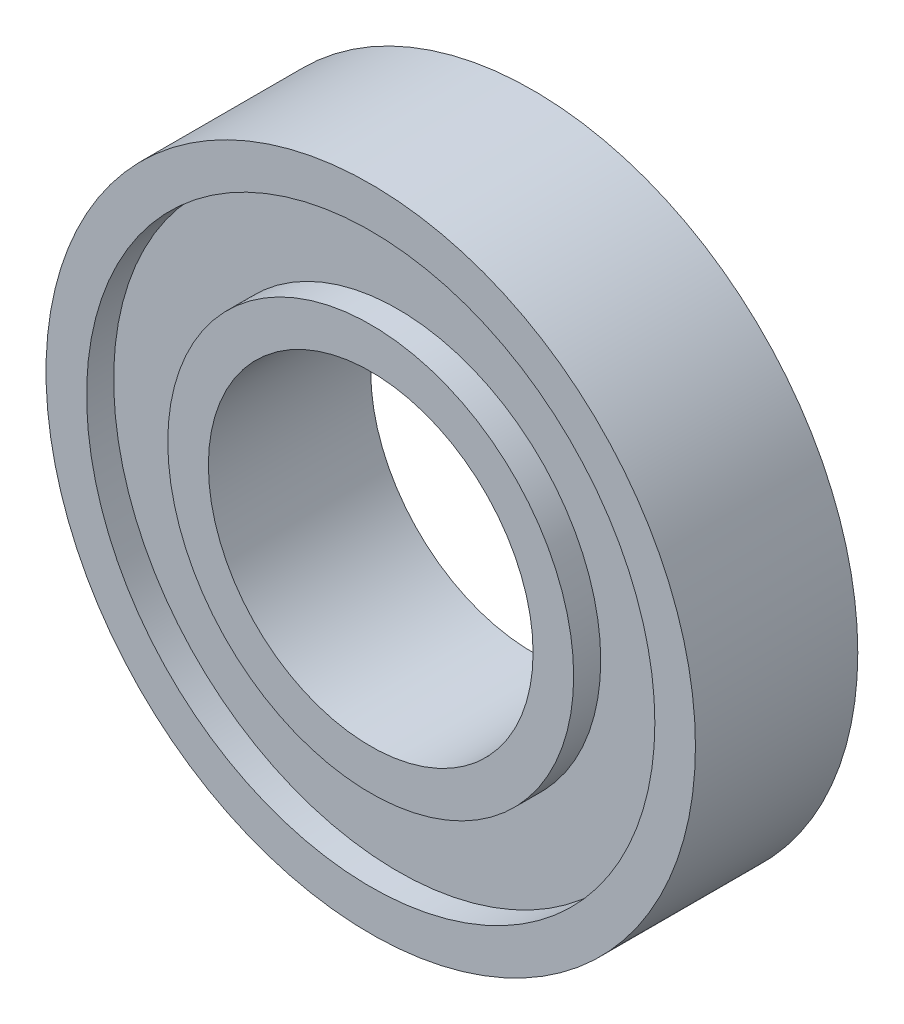
ISO-10303-21;
HEADER;
FILE_DESCRIPTION(('STEP AP214'),'2;1');
FILE_NAME('part.step','',(''),(''),'','','');
FILE_SCHEMA(('AUTOMOTIVE_DESIGN { 1 0 10303 214 1 1 1 1 }'));
ENDSEC;
DATA;
#1=APPLICATION_CONTEXT('core data for automotive mechanical design processes');
#2=APPLICATION_PROTOCOL_DEFINITION('international standard','automotive_design',2000,#1);
#3=PRODUCT_CONTEXT('',#1,'mechanical');
#4=PRODUCT('Part','Part','',(#3));
#5=PRODUCT_RELATED_PRODUCT_CATEGORY('part','',(#4));
#6=PRODUCT_DEFINITION_FORMATION('','',#4);
#7=PRODUCT_DEFINITION_CONTEXT('part definition',#1,'design');
#8=PRODUCT_DEFINITION('design','',#6,#7);
#9=PRODUCT_DEFINITION_SHAPE('','',#8);
#10=(LENGTH_UNIT() NAMED_UNIT(*) SI_UNIT(.MILLI.,.METRE.));
#11=(NAMED_UNIT(*) PLANE_ANGLE_UNIT() SI_UNIT($,.RADIAN.));
#12=(NAMED_UNIT(*) SI_UNIT($,.STERADIAN.) SOLID_ANGLE_UNIT());
#13=UNCERTAINTY_MEASURE_WITH_UNIT(LENGTH_MEASURE(1.E-05),#10,'distance_accuracy_value','');
#14=(GEOMETRIC_REPRESENTATION_CONTEXT(3) GLOBAL_UNCERTAINTY_ASSIGNED_CONTEXT((#13)) GLOBAL_UNIT_ASSIGNED_CONTEXT((#10,
#11,#12)) REPRESENTATION_CONTEXT('',''));
#15=CARTESIAN_POINT('',(0.,0.,0.));
#16=DIRECTION('',(0.,0.,1.));
#17=DIRECTION('',(1.,0.,0.));
#18=AXIS2_PLACEMENT_3D('',#15,#16,#17);
#19=CARTESIAN_POINT('',(0.,0.,-1.5));
#20=DIRECTION('',(0.,0.,1.));
#21=DIRECTION('',(1.,0.,0.));
#22=AXIS2_PLACEMENT_3D('',#19,#20,#21);
#23=PLANE('',#22);
#24=CARTESIAN_POINT('',(0.,0.,-1.5));
#25=DIRECTION('',(0.,0.,1.));
#26=DIRECTION('',(1.,0.,0.));
#27=AXIS2_PLACEMENT_3D('',#24,#25,#26);
#28=CIRCLE('',#27,3.);
#29=CARTESIAN_POINT('',(3.,0.,-1.5));
#30=VERTEX_POINT('',#29);
#31=EDGE_CURVE('E47',#30,#30,#28,.T.);
#32=ORIENTED_EDGE('',*,*,#31,.T.);
#33=EDGE_LOOP('',(#32));
#34=FACE_BOUND('',#33,.T.);
#35=CARTESIAN_POINT('',(0.,0.,-1.5));
#36=DIRECTION('',(0.,0.,1.));
#37=DIRECTION('',(1.,0.,0.));
#38=AXIS2_PLACEMENT_3D('',#35,#36,#37);
#39=CIRCLE('',#38,3.75);
#40=CARTESIAN_POINT('',(3.75,0.,-1.5));
#41=VERTEX_POINT('',#40);
#42=EDGE_CURVE('E71',#41,#41,#39,.T.);
#43=ORIENTED_EDGE('',*,*,#42,.F.);
#44=EDGE_LOOP('',(#43));
#45=FACE_BOUND('',#44,.T.);
#46=ADVANCED_FACE('F34',(#34,#45),#23,.F.);
#47=CARTESIAN_POINT('',(0.,0.,1.5));
#48=DIRECTION('',(0.,0.,1.));
#49=DIRECTION('',(1.,0.,0.));
#50=AXIS2_PLACEMENT_3D('',#47,#48,#49);
#51=PLANE('',#50);
#52=CARTESIAN_POINT('',(0.,0.,1.5));
#53=DIRECTION('',(0.,0.,1.));
#54=DIRECTION('',(1.,0.,0.));
#55=AXIS2_PLACEMENT_3D('',#52,#53,#54);
#56=CIRCLE('',#55,3.);
#57=CARTESIAN_POINT('',(3.,0.,1.5));
#58=VERTEX_POINT('',#57);
#59=EDGE_CURVE('E45',#58,#58,#56,.T.);
#60=ORIENTED_EDGE('',*,*,#59,.F.);
#61=EDGE_LOOP('',(#60));
#62=FACE_BOUND('',#61,.T.);
#63=CARTESIAN_POINT('',(0.,0.,1.5));
#64=DIRECTION('',(0.,0.,1.));
#65=DIRECTION('',(1.,0.,0.));
#66=AXIS2_PLACEMENT_3D('',#63,#64,#65);
#67=CIRCLE('',#66,3.75);
#68=CARTESIAN_POINT('',(3.75,0.,1.5));
#69=VERTEX_POINT('',#68);
#70=EDGE_CURVE('E59',#69,#69,#67,.T.);
#71=ORIENTED_EDGE('',*,*,#70,.T.);
#72=EDGE_LOOP('',(#71));
#73=FACE_BOUND('',#72,.T.);
#74=ADVANCED_FACE('F87',(#62,#73),#51,.T.);
#75=CARTESIAN_POINT('',(0.,0.,1.5));
#76=DIRECTION('',(0.,0.,1.));
#77=DIRECTION('',(1.,0.,0.));
#78=AXIS2_PLACEMENT_3D('',#75,#76,#77);
#79=CIRCLE('',#78,5.25);
#80=CARTESIAN_POINT('',(5.25,0.,1.5));
#81=VERTEX_POINT('',#80);
#82=EDGE_CURVE('E53',#81,#81,#79,.T.);
#83=ORIENTED_EDGE('',*,*,#82,.F.);
#84=EDGE_LOOP('',(#83));
#85=FACE_BOUND('',#84,.T.);
#86=CARTESIAN_POINT('',(0.,0.,1.5));
#87=DIRECTION('',(0.,0.,1.));
#88=DIRECTION('',(1.,0.,0.));
#89=AXIS2_PLACEMENT_3D('',#86,#87,#88);
#90=CIRCLE('',#89,6.);
#91=CARTESIAN_POINT('',(6.,0.,1.5));
#92=VERTEX_POINT('',#91);
#93=EDGE_CURVE('E10',#92,#92,#90,.T.);
#94=ORIENTED_EDGE('',*,*,#93,.T.);
#95=EDGE_LOOP('',(#94));
#96=FACE_BOUND('',#95,.T.);
#97=ADVANCED_FACE('F95',(#85,#96),#51,.T.);
#98=CARTESIAN_POINT('',(0.,0.,-1.5));
#99=DIRECTION('',(0.,0.,1.));
#100=DIRECTION('',(1.,0.,0.));
#101=AXIS2_PLACEMENT_3D('',#98,#99,#100);
#102=CIRCLE('',#101,5.25);
#103=CARTESIAN_POINT('',(5.25,0.,-1.5));
#104=VERTEX_POINT('',#103);
#105=EDGE_CURVE('E65',#104,#104,#102,.T.);
#106=ORIENTED_EDGE('',*,*,#105,.T.);
#107=EDGE_LOOP('',(#106));
#108=FACE_BOUND('',#107,.T.);
#109=CARTESIAN_POINT('',(0.,0.,-1.5));
#110=DIRECTION('',(0.,0.,1.));
#111=DIRECTION('',(1.,0.,0.));
#112=AXIS2_PLACEMENT_3D('',#109,#110,#111);
#113=CIRCLE('',#112,6.);
#114=CARTESIAN_POINT('',(6.,0.,-1.5));
#115=VERTEX_POINT('',#114);
#116=EDGE_CURVE('E38',#115,#115,#113,.T.);
#117=ORIENTED_EDGE('',*,*,#116,.F.);
#118=EDGE_LOOP('',(#117));
#119=FACE_BOUND('',#118,.T.);
#120=ADVANCED_FACE('F89',(#108,#119),#23,.F.);
#121=CARTESIAN_POINT('',(0.,0.,1.5));
#122=DIRECTION('',(0.,0.,-1.));
#123=DIRECTION('',(-1.,0.,0.));
#124=AXIS2_PLACEMENT_3D('',#121,#122,#123);
#125=CYLINDRICAL_SURFACE('',#124,6.);
#126=ORIENTED_EDGE('',*,*,#93,.F.);
#127=EDGE_LOOP('',(#126));
#128=FACE_BOUND('',#127,.T.);
#129=ORIENTED_EDGE('',*,*,#116,.T.);
#130=EDGE_LOOP('',(#129));
#131=FACE_BOUND('',#130,.T.);
#132=ADVANCED_FACE('F36',(#128,#131),#125,.T.);
#133=CARTESIAN_POINT('',(0.,0.,1.5));
#134=DIRECTION('',(0.,0.,-1.));
#135=DIRECTION('',(-1.,0.,0.));
#136=AXIS2_PLACEMENT_3D('',#133,#134,#135);
#137=CYLINDRICAL_SURFACE('',#136,3.);
#138=ORIENTED_EDGE('',*,*,#59,.T.);
#139=EDGE_LOOP('',(#138));
#140=FACE_BOUND('',#139,.T.);
#141=ORIENTED_EDGE('',*,*,#31,.F.);
#142=EDGE_LOOP('',(#141));
#143=FACE_BOUND('',#142,.T.);
#144=ADVANCED_FACE('F103',(#140,#143),#137,.F.);
#145=CARTESIAN_POINT('',(0.,0.,1.));
#146=DIRECTION('',(0.,0.,1.));
#147=DIRECTION('',(1.,0.,0.));
#148=AXIS2_PLACEMENT_3D('',#145,#146,#147);
#149=CYLINDRICAL_SURFACE('',#148,5.25);
#150=CARTESIAN_POINT('',(0.,0.,1.));
#151=DIRECTION('',(0.,0.,1.));
#152=DIRECTION('',(1.,0.,0.));
#153=AXIS2_PLACEMENT_3D('',#150,#151,#152);
#154=CIRCLE('',#153,5.25);
#155=CARTESIAN_POINT('',(5.25,0.,1.));
#156=VERTEX_POINT('',#155);
#157=EDGE_CURVE('E50',#156,#156,#154,.T.);
#158=ORIENTED_EDGE('',*,*,#157,.F.);
#159=EDGE_LOOP('',(#158));
#160=FACE_BOUND('',#159,.T.);
#161=ORIENTED_EDGE('',*,*,#82,.T.);
#162=EDGE_LOOP('',(#161));
#163=FACE_BOUND('',#162,.T.);
#164=ADVANCED_FACE('F128',(#160,#163),#149,.F.);
#165=CARTESIAN_POINT('',(0.,0.,1.));
#166=DIRECTION('',(0.,0.,1.));
#167=DIRECTION('',(1.,0.,0.));
#168=AXIS2_PLACEMENT_3D('',#165,#166,#167);
#169=PLANE('',#168);
#170=CARTESIAN_POINT('',(0.,0.,1.));
#171=DIRECTION('',(0.,0.,1.));
#172=DIRECTION('',(1.,0.,0.));
#173=AXIS2_PLACEMENT_3D('',#170,#171,#172);
#174=CIRCLE('',#173,3.75);
#175=CARTESIAN_POINT('',(3.75,0.,1.));
#176=VERTEX_POINT('',#175);
#177=EDGE_CURVE('E56',#176,#176,#174,.T.);
#178=ORIENTED_EDGE('',*,*,#177,.F.);
#179=EDGE_LOOP('',(#178));
#180=FACE_BOUND('',#179,.T.);
#181=ORIENTED_EDGE('',*,*,#157,.T.);
#182=EDGE_LOOP('',(#181));
#183=FACE_BOUND('',#182,.T.);
#184=ADVANCED_FACE('F124',(#180,#183),#169,.T.);
#185=CARTESIAN_POINT('',(0.,0.,1.));
#186=DIRECTION('',(0.,0.,1.));
#187=DIRECTION('',(1.,0.,0.));
#188=AXIS2_PLACEMENT_3D('',#185,#186,#187);
#189=CYLINDRICAL_SURFACE('',#188,3.75);
#190=ORIENTED_EDGE('',*,*,#177,.T.);
#191=EDGE_LOOP('',(#190));
#192=FACE_BOUND('',#191,.T.);
#193=ORIENTED_EDGE('',*,*,#70,.F.);
#194=EDGE_LOOP('',(#193));
#195=FACE_BOUND('',#194,.T.);
#196=ADVANCED_FACE('F118',(#192,#195),#189,.T.);
#197=CARTESIAN_POINT('',(0.,0.,-1.));
#198=DIRECTION('',(0.,0.,-1.));
#199=DIRECTION('',(1.,0.,0.));
#200=AXIS2_PLACEMENT_3D('',#197,#198,#199);
#201=PLANE('',#200);
#202=CARTESIAN_POINT('',(0.,0.,-1.));
#203=DIRECTION('',(0.,0.,1.));
#204=DIRECTION('',(1.,0.,0.));
#205=AXIS2_PLACEMENT_3D('',#202,#203,#204);
#206=CIRCLE('',#205,5.25);
#207=CARTESIAN_POINT('',(5.25,0.,-1.));
#208=VERTEX_POINT('',#207);
#209=EDGE_CURVE('E62',#208,#208,#206,.T.);
#210=ORIENTED_EDGE('',*,*,#209,.F.);
#211=EDGE_LOOP('',(#210));
#212=FACE_BOUND('',#211,.T.);
#213=CARTESIAN_POINT('',(0.,0.,-1.));
#214=DIRECTION('',(0.,0.,1.));
#215=DIRECTION('',(1.,0.,0.));
#216=AXIS2_PLACEMENT_3D('',#213,#214,#215);
#217=CIRCLE('',#216,3.75);
#218=CARTESIAN_POINT('',(3.75,0.,-1.));
#219=VERTEX_POINT('',#218);
#220=EDGE_CURVE('E68',#219,#219,#217,.T.);
#221=ORIENTED_EDGE('',*,*,#220,.T.);
#222=EDGE_LOOP('',(#221));
#223=FACE_BOUND('',#222,.T.);
#224=ADVANCED_FACE('F77',(#212,#223),#201,.T.);
#225=CARTESIAN_POINT('',(0.,0.,-1.));
#226=DIRECTION('',(0.,0.,-1.));
#227=DIRECTION('',(-1.,0.,0.));
#228=AXIS2_PLACEMENT_3D('',#225,#226,#227);
#229=CYLINDRICAL_SURFACE('',#228,5.25);
#230=ORIENTED_EDGE('',*,*,#209,.T.);
#231=EDGE_LOOP('',(#230));
#232=FACE_BOUND('',#231,.T.);
#233=ORIENTED_EDGE('',*,*,#105,.F.);
#234=EDGE_LOOP('',(#233));
#235=FACE_BOUND('',#234,.T.);
#236=ADVANCED_FACE('F82',(#232,#235),#229,.F.);
#237=CARTESIAN_POINT('',(0.,0.,-1.));
#238=DIRECTION('',(0.,0.,-1.));
#239=DIRECTION('',(-1.,0.,0.));
#240=AXIS2_PLACEMENT_3D('',#237,#238,#239);
#241=CYLINDRICAL_SURFACE('',#240,3.75);
#242=ORIENTED_EDGE('',*,*,#220,.F.);
#243=EDGE_LOOP('',(#242));
#244=FACE_BOUND('',#243,.T.);
#245=ORIENTED_EDGE('',*,*,#42,.T.);
#246=EDGE_LOOP('',(#245));
#247=FACE_BOUND('',#246,.T.);
#248=ADVANCED_FACE('F79',(#244,#247),#241,.T.);
#249=CLOSED_SHELL('',(#46,#74,#97,#120,#132,#144,#164,#184,#196,#224,#236,#248));
#250=MANIFOLD_SOLID_BREP('B2',#249);
#251=ADVANCED_BREP_SHAPE_REPRESENTATION('',(#18,#250),#14);
#252=SHAPE_DEFINITION_REPRESENTATION(#9,#251);
ENDSEC;
END-ISO-10303-21;
